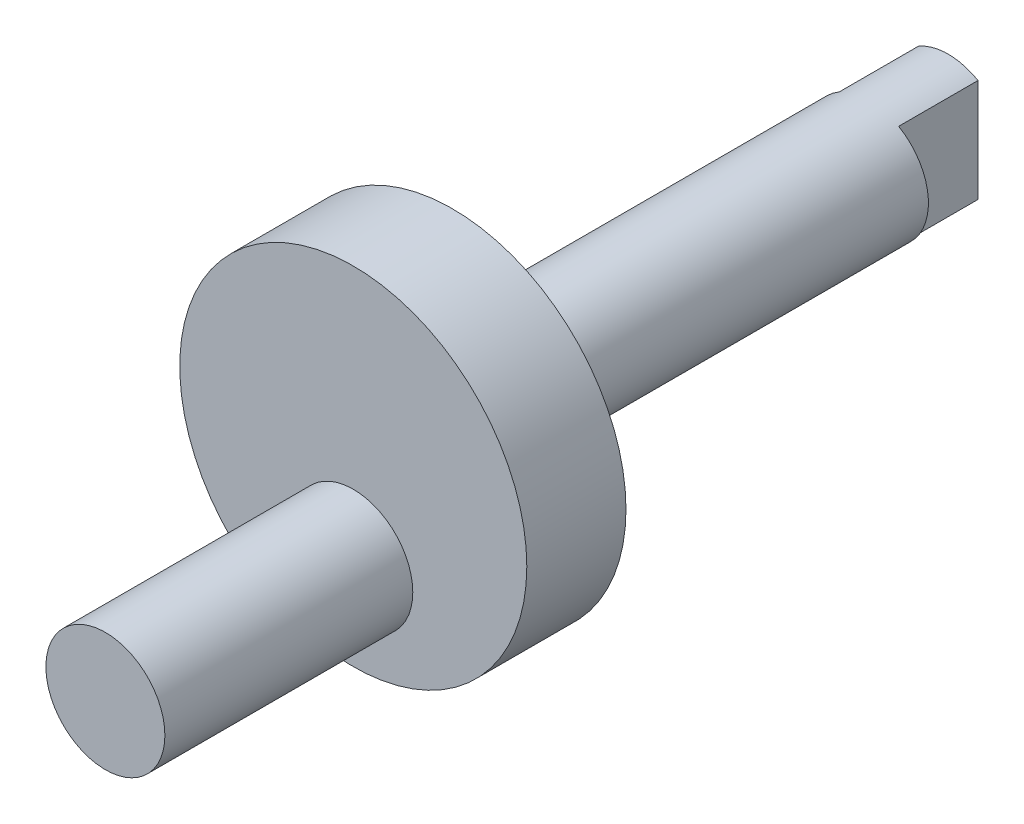
ISO-10303-21;
HEADER;
FILE_DESCRIPTION(('STEP AP214'),'2;1');
FILE_NAME('part.step','',(''),(''),'','','');
FILE_SCHEMA(('AUTOMOTIVE_DESIGN { 1 0 10303 214 1 1 1 1 }'));
ENDSEC;
DATA;
#1=APPLICATION_CONTEXT('core data for automotive mechanical design processes');
#2=APPLICATION_PROTOCOL_DEFINITION('international standard','automotive_design',2000,#1);
#3=PRODUCT_CONTEXT('',#1,'mechanical');
#4=PRODUCT('Part','Part','',(#3));
#5=PRODUCT_RELATED_PRODUCT_CATEGORY('part','',(#4));
#6=PRODUCT_DEFINITION_FORMATION('','',#4);
#7=PRODUCT_DEFINITION_CONTEXT('part definition',#1,'design');
#8=PRODUCT_DEFINITION('design','',#6,#7);
#9=PRODUCT_DEFINITION_SHAPE('','',#8);
#10=(LENGTH_UNIT() NAMED_UNIT(*) SI_UNIT(.MILLI.,.METRE.));
#11=(NAMED_UNIT(*) PLANE_ANGLE_UNIT() SI_UNIT($,.RADIAN.));
#12=(NAMED_UNIT(*) SI_UNIT($,.STERADIAN.) SOLID_ANGLE_UNIT());
#13=UNCERTAINTY_MEASURE_WITH_UNIT(LENGTH_MEASURE(1.E-05),#10,'distance_accuracy_value','');
#14=(GEOMETRIC_REPRESENTATION_CONTEXT(3) GLOBAL_UNCERTAINTY_ASSIGNED_CONTEXT((#13)) GLOBAL_UNIT_ASSIGNED_CONTEXT((#10,
#11,#12)) REPRESENTATION_CONTEXT('',''));
#15=CARTESIAN_POINT('',(0.,0.,0.));
#16=DIRECTION('',(0.,0.,1.));
#17=DIRECTION('',(1.,0.,0.));
#18=AXIS2_PLACEMENT_3D('',#15,#16,#17);
#19=CARTESIAN_POINT('',(0.,0.,50.));
#20=DIRECTION('',(0.,0.,-1.));
#21=DIRECTION('',(-1.,0.,0.));
#22=AXIS2_PLACEMENT_3D('',#19,#20,#21);
#23=CYLINDRICAL_SURFACE('',#22,6.);
#24=CARTESIAN_POINT('',(0.,0.,0.));
#25=DIRECTION('',(0.,0.,1.));
#26=DIRECTION('',(1.,0.,0.));
#27=AXIS2_PLACEMENT_3D('',#24,#25,#26);
#28=CIRCLE('',#27,6.);
#29=CARTESIAN_POINT('',(3.,5.19615242270663,0.));
#30=VERTEX_POINT('',#29);
#31=CARTESIAN_POINT('',(-3.,5.19615242270663,0.));
#32=VERTEX_POINT('',#31);
#33=EDGE_CURVE('E79',#30,#32,#28,.T.);
#34=ORIENTED_EDGE('',*,*,#33,.T.);
#35=DIRECTION('',(0.,0.,-1.));
#36=VECTOR('',#35,1.);
#37=CARTESIAN_POINT('',(-3.,5.19615242270663,50.));
#38=LINE('',#37,#36);
#39=CARTESIAN_POINT('',(-3.,5.19615242270663,8.));
#40=VERTEX_POINT('',#39);
#41=EDGE_CURVE('E131',#40,#32,#38,.T.);
#42=ORIENTED_EDGE('',*,*,#41,.F.);
#43=CARTESIAN_POINT('',(0.,0.,8.));
#44=DIRECTION('',(0.,0.,-1.));
#45=DIRECTION('',(-1.,0.,0.));
#46=AXIS2_PLACEMENT_3D('',#43,#44,#45);
#47=CIRCLE('',#46,6.);
#48=CARTESIAN_POINT('',(-3.,-5.19615242270663,8.));
#49=VERTEX_POINT('',#48);
#50=EDGE_CURVE('E13',#49,#40,#47,.T.);
#51=ORIENTED_EDGE('',*,*,#50,.F.);
#52=DIRECTION('',(0.,0.,-1.));
#53=VECTOR('',#52,1.);
#54=CARTESIAN_POINT('',(-3.,-5.19615242270663,50.));
#55=LINE('',#54,#53);
#56=CARTESIAN_POINT('',(-3.,-5.19615242270663,0.));
#57=VERTEX_POINT('',#56);
#58=EDGE_CURVE('E111',#57,#49,#55,.F.);
#59=ORIENTED_EDGE('',*,*,#58,.F.);
#60=CARTESIAN_POINT('',(3.,-5.19615242270663,0.));
#61=VERTEX_POINT('',#60);
#62=EDGE_CURVE('E72',#57,#61,#28,.T.);
#63=ORIENTED_EDGE('',*,*,#62,.T.);
#64=DIRECTION('',(0.,0.,-1.));
#65=VECTOR('',#64,1.);
#66=CARTESIAN_POINT('',(3.,-5.19615242270663,50.));
#67=LINE('',#66,#65);
#68=CARTESIAN_POINT('',(3.,-5.19615242270663,8.));
#69=VERTEX_POINT('',#68);
#70=EDGE_CURVE('E104',#61,#69,#67,.F.);
#71=ORIENTED_EDGE('',*,*,#70,.T.);
#72=CARTESIAN_POINT('',(3.,5.19615242270663,8.));
#73=VERTEX_POINT('',#72);
#74=EDGE_CURVE('E61',#73,#69,#47,.T.);
#75=ORIENTED_EDGE('',*,*,#74,.F.);
#76=DIRECTION('',(0.,0.,-1.));
#77=VECTOR('',#76,1.);
#78=CARTESIAN_POINT('',(3.,5.19615242270663,50.));
#79=LINE('',#78,#77);
#80=EDGE_CURVE('E102',#73,#30,#79,.T.);
#81=ORIENTED_EDGE('',*,*,#80,.T.);
#82=EDGE_LOOP('',(#34,#42,#51,#59,#63,#71,#75,#81));
#83=FACE_BOUND('',#82,.T.);
#84=CARTESIAN_POINT('',(0.,0.,50.));
#85=DIRECTION('',(0.,0.,1.));
#86=DIRECTION('',(1.,0.,0.));
#87=AXIS2_PLACEMENT_3D('',#84,#85,#86);
#88=CIRCLE('',#87,6.);
#89=CARTESIAN_POINT('',(6.,0.,50.));
#90=VERTEX_POINT('',#89);
#91=EDGE_CURVE('E107',#90,#90,#88,.T.);
#92=ORIENTED_EDGE('',*,*,#91,.F.);
#93=EDGE_LOOP('',(#92));
#94=FACE_BOUND('',#93,.T.);
#95=ADVANCED_FACE('F58',(#83,#94),#23,.T.);
#96=CARTESIAN_POINT('',(0.,0.,0.));
#97=DIRECTION('',(0.,0.,1.));
#98=DIRECTION('',(1.,0.,0.));
#99=AXIS2_PLACEMENT_3D('',#96,#97,#98);
#100=PLANE('',#99);
#101=DIRECTION('',(0.,-1.,0.));
#102=VECTOR('',#101,1.);
#103=CARTESIAN_POINT('',(-3.,0.,0.));
#104=LINE('',#103,#102);
#105=EDGE_CURVE('E106',#32,#57,#104,.T.);
#106=ORIENTED_EDGE('',*,*,#105,.F.);
#107=ORIENTED_EDGE('',*,*,#33,.F.);
#108=DIRECTION('',(0.,-1.,0.));
#109=VECTOR('',#108,1.);
#110=CARTESIAN_POINT('',(3.,0.,0.));
#111=LINE('',#110,#109);
#112=EDGE_CURVE('E99',#30,#61,#111,.T.);
#113=ORIENTED_EDGE('',*,*,#112,.T.);
#114=ORIENTED_EDGE('',*,*,#62,.F.);
#115=EDGE_LOOP('',(#106,#107,#113,#114));
#116=FACE_BOUND('',#115,.T.);
#117=ADVANCED_FACE('F114',(#116),#100,.F.);
#118=CARTESIAN_POINT('',(0.,0.,60.));
#119=DIRECTION('',(0.,0.,-1.));
#120=DIRECTION('',(-1.,0.,0.));
#121=AXIS2_PLACEMENT_3D('',#118,#119,#120);
#122=CYLINDRICAL_SURFACE('',#121,17.5);
#123=CARTESIAN_POINT('',(0.,0.,60.));
#124=DIRECTION('',(0.,0.,1.));
#125=DIRECTION('',(1.,0.,0.));
#126=AXIS2_PLACEMENT_3D('',#123,#124,#125);
#127=CIRCLE('',#126,17.5);
#128=CARTESIAN_POINT('',(17.5,0.,60.));
#129=VERTEX_POINT('',#128);
#130=EDGE_CURVE('E118',#129,#129,#127,.T.);
#131=ORIENTED_EDGE('',*,*,#130,.F.);
#132=EDGE_LOOP('',(#131));
#133=FACE_BOUND('',#132,.T.);
#134=CARTESIAN_POINT('',(0.,0.,50.));
#135=DIRECTION('',(0.,0.,1.));
#136=DIRECTION('',(1.,0.,0.));
#137=AXIS2_PLACEMENT_3D('',#134,#135,#136);
#138=CIRCLE('',#137,17.5);
#139=CARTESIAN_POINT('',(17.5,0.,50.));
#140=VERTEX_POINT('',#139);
#141=EDGE_CURVE('E137',#140,#140,#138,.T.);
#142=ORIENTED_EDGE('',*,*,#141,.T.);
#143=EDGE_LOOP('',(#142));
#144=FACE_BOUND('',#143,.T.);
#145=ADVANCED_FACE('F144',(#133,#144),#122,.T.);
#146=CARTESIAN_POINT('',(0.,0.,60.));
#147=DIRECTION('',(0.,0.,1.));
#148=DIRECTION('',(1.,0.,0.));
#149=AXIS2_PLACEMENT_3D('',#146,#147,#148);
#150=PLANE('',#149);
#151=CARTESIAN_POINT('',(0.,-8.,60.));
#152=DIRECTION('',(0.,0.,1.));
#153=DIRECTION('',(1.,0.,0.));
#154=AXIS2_PLACEMENT_3D('',#151,#152,#153);
#155=CIRCLE('',#154,6.);
#156=CARTESIAN_POINT('',(6.,-8.,60.));
#157=VERTEX_POINT('',#156);
#158=EDGE_CURVE('E133',#157,#157,#155,.T.);
#159=ORIENTED_EDGE('',*,*,#158,.F.);
#160=EDGE_LOOP('',(#159));
#161=FACE_BOUND('',#160,.T.);
#162=ORIENTED_EDGE('',*,*,#130,.T.);
#163=EDGE_LOOP('',(#162));
#164=FACE_BOUND('',#163,.T.);
#165=ADVANCED_FACE('F149',(#161,#164),#150,.T.);
#166=CARTESIAN_POINT('',(0.,0.,50.));
#167=DIRECTION('',(0.,0.,1.));
#168=DIRECTION('',(1.,0.,0.));
#169=AXIS2_PLACEMENT_3D('',#166,#167,#168);
#170=PLANE('',#169);
#171=ORIENTED_EDGE('',*,*,#91,.T.);
#172=EDGE_LOOP('',(#171));
#173=FACE_BOUND('',#172,.T.);
#174=ORIENTED_EDGE('',*,*,#141,.F.);
#175=EDGE_LOOP('',(#174));
#176=FACE_BOUND('',#175,.T.);
#177=ADVANCED_FACE('F146',(#173,#176),#170,.F.);
#178=CARTESIAN_POINT('',(0.,-8.,85.));
#179=DIRECTION('',(0.,0.,-1.));
#180=DIRECTION('',(-1.,0.,0.));
#181=AXIS2_PLACEMENT_3D('',#178,#179,#180);
#182=CYLINDRICAL_SURFACE('',#181,6.);
#183=CARTESIAN_POINT('',(0.,-8.,85.));
#184=DIRECTION('',(0.,0.,1.));
#185=DIRECTION('',(1.,0.,0.));
#186=AXIS2_PLACEMENT_3D('',#183,#184,#185);
#187=CIRCLE('',#186,6.);
#188=CARTESIAN_POINT('',(6.,-8.,85.));
#189=VERTEX_POINT('',#188);
#190=EDGE_CURVE('E134',#189,#189,#187,.T.);
#191=ORIENTED_EDGE('',*,*,#190,.F.);
#192=EDGE_LOOP('',(#191));
#193=FACE_BOUND('',#192,.T.);
#194=ORIENTED_EDGE('',*,*,#158,.T.);
#195=EDGE_LOOP('',(#194));
#196=FACE_BOUND('',#195,.T.);
#197=ADVANCED_FACE('F148',(#193,#196),#182,.T.);
#198=CARTESIAN_POINT('',(0.,-8.,85.));
#199=DIRECTION('',(0.,0.,1.));
#200=DIRECTION('',(1.,0.,0.));
#201=AXIS2_PLACEMENT_3D('',#198,#199,#200);
#202=PLANE('',#201);
#203=ORIENTED_EDGE('',*,*,#190,.T.);
#204=EDGE_LOOP('',(#203));
#205=FACE_BOUND('',#204,.T.);
#206=ADVANCED_FACE('F156',(#205),#202,.T.);
#207=CARTESIAN_POINT('',(3.,-6.,8.));
#208=DIRECTION('',(-1.,0.,0.));
#209=DIRECTION('',(0.,0.,1.));
#210=AXIS2_PLACEMENT_3D('',#207,#208,#209);
#211=PLANE('',#210);
#212=DIRECTION('',(0.,1.,0.));
#213=VECTOR('',#212,1.);
#214=CARTESIAN_POINT('',(3.,-6.,8.));
#215=LINE('',#214,#213);
#216=EDGE_CURVE('E123',#69,#73,#215,.T.);
#217=ORIENTED_EDGE('',*,*,#216,.F.);
#218=ORIENTED_EDGE('',*,*,#70,.F.);
#219=ORIENTED_EDGE('',*,*,#112,.F.);
#220=ORIENTED_EDGE('',*,*,#80,.F.);
#221=EDGE_LOOP('',(#217,#218,#219,#220));
#222=FACE_BOUND('',#221,.T.);
#223=ADVANCED_FACE('F101',(#222),#211,.F.);
#224=CARTESIAN_POINT('',(0.,0.,8.));
#225=DIRECTION('',(0.,0.,-1.));
#226=DIRECTION('',(-1.,0.,0.));
#227=AXIS2_PLACEMENT_3D('',#224,#225,#226);
#228=PLANE('',#227);
#229=ORIENTED_EDGE('',*,*,#74,.T.);
#230=ORIENTED_EDGE('',*,*,#216,.T.);
#231=EDGE_LOOP('',(#229,#230));
#232=FACE_BOUND('',#231,.T.);
#233=ADVANCED_FACE('F122',(#232),#228,.T.);
#234=ORIENTED_EDGE('',*,*,#50,.T.);
#235=DIRECTION('',(0.,1.,0.));
#236=VECTOR('',#235,1.);
#237=CARTESIAN_POINT('',(-3.,-6.,8.));
#238=LINE('',#237,#236);
#239=EDGE_CURVE('E124',#49,#40,#238,.T.);
#240=ORIENTED_EDGE('',*,*,#239,.F.);
#241=EDGE_LOOP('',(#234,#240));
#242=FACE_BOUND('',#241,.T.);
#243=ADVANCED_FACE('F220',(#242),#228,.T.);
#244=CARTESIAN_POINT('',(-3.,-6.,8.));
#245=DIRECTION('',(-1.,0.,0.));
#246=DIRECTION('',(0.,0.,1.));
#247=AXIS2_PLACEMENT_3D('',#244,#245,#246);
#248=PLANE('',#247);
#249=ORIENTED_EDGE('',*,*,#41,.T.);
#250=ORIENTED_EDGE('',*,*,#105,.T.);
#251=ORIENTED_EDGE('',*,*,#58,.T.);
#252=ORIENTED_EDGE('',*,*,#239,.T.);
#253=EDGE_LOOP('',(#249,#250,#251,#252));
#254=FACE_BOUND('',#253,.T.);
#255=ADVANCED_FACE('F229',(#254),#248,.T.);
#256=CLOSED_SHELL('',(#95,#117,#145,#165,#177,#197,#206,#223,#233,#243,#255));
#257=MANIFOLD_SOLID_BREP('B2',#256);
#258=ADVANCED_BREP_SHAPE_REPRESENTATION('',(#18,#257),#14);
#259=SHAPE_DEFINITION_REPRESENTATION(#9,#258);
ENDSEC;
END-ISO-10303-21;
